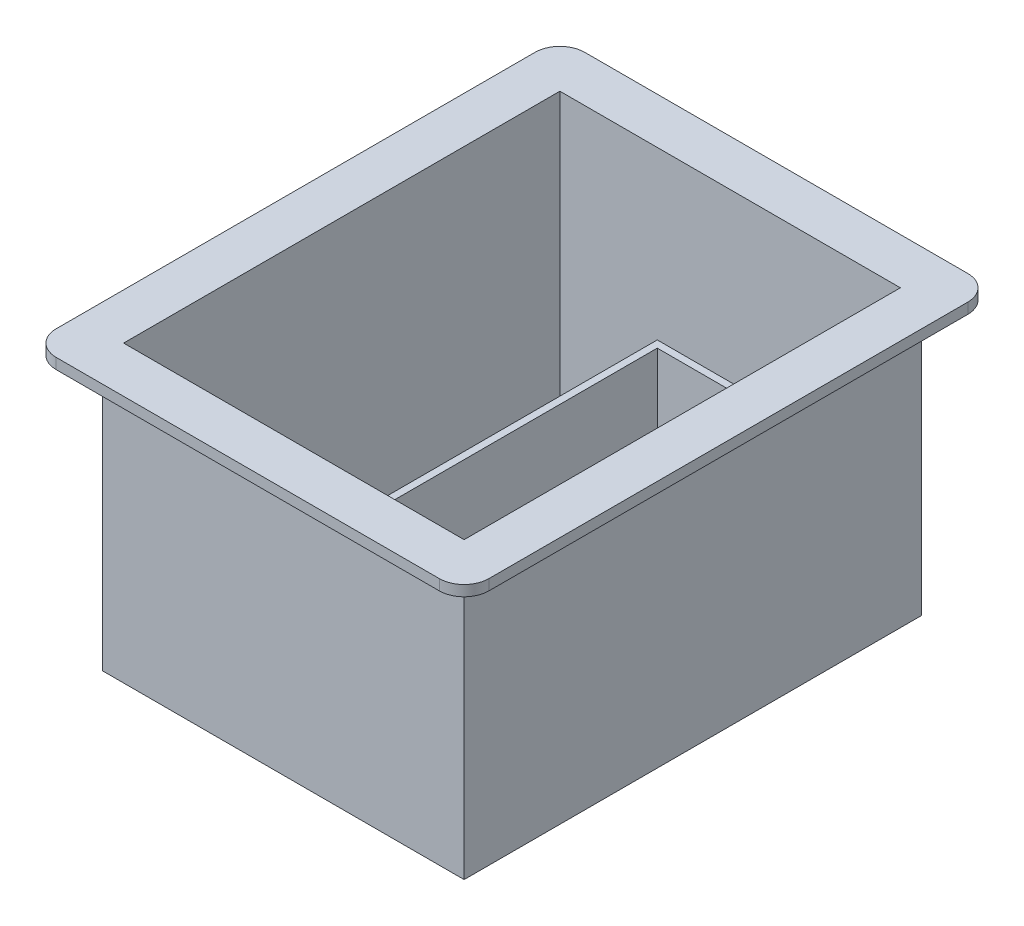
ISO-10303-21;
HEADER;
FILE_DESCRIPTION(('STEP AP214'),'2;1');
FILE_NAME('part.step','',(''),(''),'','','');
FILE_SCHEMA(('AUTOMOTIVE_DESIGN { 1 0 10303 214 1 1 1 1 }'));
ENDSEC;
DATA;
#1=APPLICATION_CONTEXT('core data for automotive mechanical design processes');
#2=APPLICATION_PROTOCOL_DEFINITION('international standard','automotive_design',2000,#1);
#3=PRODUCT_CONTEXT('',#1,'mechanical');
#4=PRODUCT('Part','Part','',(#3));
#5=PRODUCT_RELATED_PRODUCT_CATEGORY('part','',(#4));
#6=PRODUCT_DEFINITION_FORMATION('','',#4);
#7=PRODUCT_DEFINITION_CONTEXT('part definition',#1,'design');
#8=PRODUCT_DEFINITION('design','',#6,#7);
#9=PRODUCT_DEFINITION_SHAPE('','',#8);
#10=(LENGTH_UNIT() NAMED_UNIT(*) SI_UNIT(.MILLI.,.METRE.));
#11=(NAMED_UNIT(*) PLANE_ANGLE_UNIT() SI_UNIT($,.RADIAN.));
#12=(NAMED_UNIT(*) SI_UNIT($,.STERADIAN.) SOLID_ANGLE_UNIT());
#13=UNCERTAINTY_MEASURE_WITH_UNIT(LENGTH_MEASURE(1.E-05),#10,'distance_accuracy_value','');
#14=(GEOMETRIC_REPRESENTATION_CONTEXT(3) GLOBAL_UNCERTAINTY_ASSIGNED_CONTEXT((#13)) GLOBAL_UNIT_ASSIGNED_CONTEXT((#10,
#11,#12)) REPRESENTATION_CONTEXT('',''));
#15=CARTESIAN_POINT('',(0.,0.,0.));
#16=DIRECTION('',(0.,0.,1.));
#17=DIRECTION('',(1.,0.,0.));
#18=AXIS2_PLACEMENT_3D('',#15,#16,#17);
#19=CARTESIAN_POINT('',(0.,3.,0.));
#20=DIRECTION('',(0.,1.,0.));
#21=DIRECTION('',(0.,0.,1.));
#22=AXIS2_PLACEMENT_3D('',#19,#20,#21);
#23=PLANE('',#22);
#24=DIRECTION('',(1.,0.,0.));
#25=VECTOR('',#24,1.);
#26=CARTESIAN_POINT('',(30.4598158430387,3.,-38.5685944637824));
#27=LINE('',#26,#25);
#28=CARTESIAN_POINT('',(30.4598158430387,3.,-38.5685944637824));
#29=VERTEX_POINT('',#28);
#30=CARTESIAN_POINT('',(94.4598158430387,3.,-38.5685944637824));
#31=VERTEX_POINT('',#30);
#32=EDGE_CURVE('E339',#29,#31,#27,.T.);
#33=ORIENTED_EDGE('',*,*,#32,.F.);
#34=DIRECTION('',(0.,0.,1.));
#35=VECTOR('',#34,1.);
#36=CARTESIAN_POINT('',(30.4598158430387,3.,-127.568594463782));
#37=LINE('',#36,#35);
#38=CARTESIAN_POINT('',(30.4598158430387,3.,-126.));
#39=VERTEX_POINT('',#38);
#40=EDGE_CURVE('E288',#39,#29,#37,.T.);
#41=ORIENTED_EDGE('',*,*,#40,.F.);
#42=DIRECTION('',(-1.,0.,0.));
#43=VECTOR('',#42,1.);
#44=CARTESIAN_POINT('',(3.,3.,-126.));
#45=LINE('',#44,#43);
#46=CARTESIAN_POINT('',(3.,3.,-126.));
#47=VERTEX_POINT('',#46);
#48=EDGE_CURVE('E394',#39,#47,#45,.T.);
#49=ORIENTED_EDGE('',*,*,#48,.T.);
#50=DIRECTION('',(0.,0.,1.));
#51=VECTOR('',#50,1.);
#52=CARTESIAN_POINT('',(3.,3.,-126.));
#53=LINE('',#52,#51);
#54=CARTESIAN_POINT('',(3.00000000000003,3.,-37.));
#55=VERTEX_POINT('',#54);
#56=EDGE_CURVE('E382',#47,#55,#53,.T.);
#57=ORIENTED_EDGE('',*,*,#56,.T.);
#58=DIRECTION('',(-1.,0.,0.));
#59=VECTOR('',#58,1.);
#60=CARTESIAN_POINT('',(3.00000000000003,3.,-37.));
#61=LINE('',#60,#59);
#62=CARTESIAN_POINT('',(65.,3.,-37.));
#63=VERTEX_POINT('',#62);
#64=EDGE_CURVE('E357',#63,#55,#61,.T.);
#65=ORIENTED_EDGE('',*,*,#64,.F.);
#66=DIRECTION('',(0.,0.,-1.));
#67=VECTOR('',#66,1.);
#68=CARTESIAN_POINT('',(65.,3.,-2.99999999999999));
#69=LINE('',#68,#67);
#70=CARTESIAN_POINT('',(65.,3.,-2.99999999999999));
#71=VERTEX_POINT('',#70);
#72=EDGE_CURVE('E351',#71,#63,#69,.T.);
#73=ORIENTED_EDGE('',*,*,#72,.F.);
#74=DIRECTION('',(1.,0.,0.));
#75=VECTOR('',#74,1.);
#76=CARTESIAN_POINT('',(3.00000000000002,3.,-3.));
#77=LINE('',#76,#75);
#78=CARTESIAN_POINT('',(99.,3.,-3.));
#79=VERTEX_POINT('',#78);
#80=EDGE_CURVE('E386',#71,#79,#77,.T.);
#81=ORIENTED_EDGE('',*,*,#80,.T.);
#82=DIRECTION('',(0.,0.,-1.));
#83=VECTOR('',#82,1.);
#84=CARTESIAN_POINT('',(99.,3.,-126.));
#85=LINE('',#84,#83);
#86=CARTESIAN_POINT('',(99.,3.,-126.));
#87=VERTEX_POINT('',#86);
#88=EDGE_CURVE('E390',#79,#87,#85,.T.);
#89=ORIENTED_EDGE('',*,*,#88,.T.);
#90=CARTESIAN_POINT('',(94.4598158430387,3.,-126.));
#91=VERTEX_POINT('',#90);
#92=EDGE_CURVE('E395',#87,#91,#45,.T.);
#93=ORIENTED_EDGE('',*,*,#92,.T.);
#94=DIRECTION('',(0.,0.,-1.));
#95=VECTOR('',#94,1.);
#96=CARTESIAN_POINT('',(94.4598158430387,3.,-127.568594463782));
#97=LINE('',#96,#95);
#98=EDGE_CURVE('E330',#31,#91,#97,.T.);
#99=ORIENTED_EDGE('',*,*,#98,.F.);
#100=EDGE_LOOP('',(#33,#41,#49,#57,#65,#73,#81,#89,#93,#99));
#101=FACE_BOUND('',#100,.T.);
#102=ADVANCED_FACE('F39',(#101),#23,.T.);
#103=CARTESIAN_POINT('',(3.,3.,-126.));
#104=DIRECTION('',(0.,0.,-1.));
#105=DIRECTION('',(-1.,0.,0.));
#106=AXIS2_PLACEMENT_3D('',#103,#104,#105);
#107=PLANE('',#106);
#108=DIRECTION('',(0.,-1.,0.));
#109=VECTOR('',#108,1.);
#110=CARTESIAN_POINT('',(30.4598158430387,3.,-126.));
#111=LINE('',#110,#109);
#112=CARTESIAN_POINT('',(30.4598158430387,33.,-126.));
#113=VERTEX_POINT('',#112);
#114=EDGE_CURVE('E507',#113,#39,#111,.T.);
#115=ORIENTED_EDGE('',*,*,#114,.F.);
#116=DIRECTION('',(1.,0.,0.));
#117=VECTOR('',#116,1.);
#118=CARTESIAN_POINT('',(3.,33.,-126.));
#119=LINE('',#118,#117);
#120=CARTESIAN_POINT('',(94.4598158430387,33.,-126.));
#121=VERTEX_POINT('',#120);
#122=EDGE_CURVE('E499',#113,#121,#119,.T.);
#123=ORIENTED_EDGE('',*,*,#122,.T.);
#124=DIRECTION('',(0.,1.,0.));
#125=VECTOR('',#124,1.);
#126=CARTESIAN_POINT('',(94.4598158430387,3.,-126.));
#127=LINE('',#126,#125);
#128=EDGE_CURVE('E503',#91,#121,#127,.T.);
#129=ORIENTED_EDGE('',*,*,#128,.F.);
#130=ORIENTED_EDGE('',*,*,#92,.F.);
#131=DIRECTION('',(0.,1.,0.));
#132=VECTOR('',#131,1.);
#133=CARTESIAN_POINT('',(99.,3.,-126.));
#134=LINE('',#133,#132);
#135=CARTESIAN_POINT('',(99.,80.,-126.));
#136=VERTEX_POINT('',#135);
#137=EDGE_CURVE('E418',#87,#136,#134,.T.);
#138=ORIENTED_EDGE('',*,*,#137,.T.);
#139=DIRECTION('',(-1.,0.,0.));
#140=VECTOR('',#139,1.);
#141=CARTESIAN_POINT('',(3.,80.,-126.));
#142=LINE('',#141,#140);
#143=CARTESIAN_POINT('',(3.,80.,-126.));
#144=VERTEX_POINT('',#143);
#145=EDGE_CURVE('E387',#136,#144,#142,.T.);
#146=ORIENTED_EDGE('',*,*,#145,.T.);
#147=DIRECTION('',(0.,1.,0.));
#148=VECTOR('',#147,1.);
#149=CARTESIAN_POINT('',(3.,3.,-126.));
#150=LINE('',#149,#148);
#151=EDGE_CURVE('E414',#47,#144,#150,.T.);
#152=ORIENTED_EDGE('',*,*,#151,.F.);
#153=ORIENTED_EDGE('',*,*,#48,.F.);
#154=EDGE_LOOP('',(#115,#123,#129,#130,#138,#146,#152,#153));
#155=FACE_BOUND('',#154,.T.);
#156=ADVANCED_FACE('F594',(#155),#107,.F.);
#157=CARTESIAN_POINT('',(3.,3.,-126.));
#158=DIRECTION('',(-1.,0.,0.));
#159=DIRECTION('',(0.,0.,1.));
#160=AXIS2_PLACEMENT_3D('',#157,#158,#159);
#161=PLANE('',#160);
#162=DIRECTION('',(0.,-1.,0.));
#163=VECTOR('',#162,1.);
#164=CARTESIAN_POINT('',(3.00000000000003,33.,-37.));
#165=LINE('',#164,#163);
#166=CARTESIAN_POINT('',(3.00000000000003,33.,-37.));
#167=VERTEX_POINT('',#166);
#168=EDGE_CURVE('E366',#167,#55,#165,.T.);
#169=ORIENTED_EDGE('',*,*,#168,.T.);
#170=ORIENTED_EDGE('',*,*,#56,.F.);
#171=ORIENTED_EDGE('',*,*,#151,.T.);
#172=DIRECTION('',(0.,0.,1.));
#173=VECTOR('',#172,1.);
#174=CARTESIAN_POINT('',(3.,80.,-126.));
#175=LINE('',#174,#173);
#176=CARTESIAN_POINT('',(3.00000000000002,80.,-3.));
#177=VERTEX_POINT('',#176);
#178=EDGE_CURVE('E381',#144,#177,#175,.T.);
#179=ORIENTED_EDGE('',*,*,#178,.T.);
#180=DIRECTION('',(0.,1.,0.));
#181=VECTOR('',#180,1.);
#182=CARTESIAN_POINT('',(3.00000000000002,3.,-3.));
#183=LINE('',#182,#181);
#184=CARTESIAN_POINT('',(3.00000000000002,3.,-3.));
#185=VERTEX_POINT('',#184);
#186=EDGE_CURVE('E399',#185,#177,#183,.T.);
#187=ORIENTED_EDGE('',*,*,#186,.F.);
#188=DIRECTION('',(0.,0.,1.));
#189=VECTOR('',#188,1.);
#190=CARTESIAN_POINT('',(3.00000000000002,3.,-3.));
#191=LINE('',#190,#189);
#192=CARTESIAN_POINT('',(3.00000000000002,3.,-35.));
#193=VERTEX_POINT('',#192);
#194=EDGE_CURVE('E294',#193,#185,#191,.T.);
#195=ORIENTED_EDGE('',*,*,#194,.F.);
#196=DIRECTION('',(0.,1.,0.));
#197=VECTOR('',#196,1.);
#198=CARTESIAN_POINT('',(3.00000000000002,3.,-35.));
#199=LINE('',#198,#197);
#200=CARTESIAN_POINT('',(3.00000000000002,33.,-35.));
#201=VERTEX_POINT('',#200);
#202=EDGE_CURVE('E279',#193,#201,#199,.T.);
#203=ORIENTED_EDGE('',*,*,#202,.T.);
#204=DIRECTION('',(0.,0.,1.));
#205=VECTOR('',#204,1.);
#206=CARTESIAN_POINT('',(3.00000000000003,33.,-2.99999999999999));
#207=LINE('',#206,#205);
#208=EDGE_CURVE('E352',#167,#201,#207,.T.);
#209=ORIENTED_EDGE('',*,*,#208,.F.);
#210=EDGE_LOOP('',(#169,#170,#171,#179,#187,#195,#203,#209));
#211=FACE_BOUND('',#210,.T.);
#212=ADVANCED_FACE('F600',(#211),#161,.F.);
#213=CARTESIAN_POINT('',(3.00000000000002,3.,-3.));
#214=DIRECTION('',(0.,0.,1.));
#215=DIRECTION('',(1.,0.,0.));
#216=AXIS2_PLACEMENT_3D('',#213,#214,#215);
#217=PLANE('',#216);
#218=DIRECTION('',(0.,-1.,0.));
#219=VECTOR('',#218,1.);
#220=CARTESIAN_POINT('',(65.,33.,-2.99999999999999));
#221=LINE('',#220,#219);
#222=CARTESIAN_POINT('',(65.,33.,-2.99999999999999));
#223=VERTEX_POINT('',#222);
#224=EDGE_CURVE('E378',#223,#71,#221,.T.);
#225=ORIENTED_EDGE('',*,*,#224,.F.);
#226=DIRECTION('',(1.,0.,0.));
#227=VECTOR('',#226,1.);
#228=CARTESIAN_POINT('',(3.00000000000003,33.,-2.99999999999999));
#229=LINE('',#228,#227);
#230=CARTESIAN_POINT('',(63.,33.,-3.));
#231=VERTEX_POINT('',#230);
#232=EDGE_CURVE('E356',#231,#223,#229,.T.);
#233=ORIENTED_EDGE('',*,*,#232,.F.);
#234=DIRECTION('',(0.,1.,0.));
#235=VECTOR('',#234,1.);
#236=CARTESIAN_POINT('',(63.,3.,-3.));
#237=LINE('',#236,#235);
#238=CARTESIAN_POINT('',(63.,3.,-3.));
#239=VERTEX_POINT('',#238);
#240=EDGE_CURVE('E311',#239,#231,#237,.T.);
#241=ORIENTED_EDGE('',*,*,#240,.F.);
#242=DIRECTION('',(1.,0.,0.));
#243=VECTOR('',#242,1.);
#244=CARTESIAN_POINT('',(3.00000000000002,3.,-3.));
#245=LINE('',#244,#243);
#246=EDGE_CURVE('E298',#185,#239,#245,.T.);
#247=ORIENTED_EDGE('',*,*,#246,.F.);
#248=ORIENTED_EDGE('',*,*,#186,.T.);
#249=DIRECTION('',(1.,0.,0.));
#250=VECTOR('',#249,1.);
#251=CARTESIAN_POINT('',(3.00000000000002,80.,-3.));
#252=LINE('',#251,#250);
#253=CARTESIAN_POINT('',(99.,80.,-3.));
#254=VERTEX_POINT('',#253);
#255=EDGE_CURVE('E403',#177,#254,#252,.T.);
#256=ORIENTED_EDGE('',*,*,#255,.T.);
#257=DIRECTION('',(0.,1.,0.));
#258=VECTOR('',#257,1.);
#259=CARTESIAN_POINT('',(99.,3.,-3.));
#260=LINE('',#259,#258);
#261=EDGE_CURVE('E421',#79,#254,#260,.T.);
#262=ORIENTED_EDGE('',*,*,#261,.F.);
#263=ORIENTED_EDGE('',*,*,#80,.F.);
#264=EDGE_LOOP('',(#225,#233,#241,#247,#248,#256,#262,#263));
#265=FACE_BOUND('',#264,.T.);
#266=ADVANCED_FACE('F612',(#265),#217,.F.);
#267=CARTESIAN_POINT('',(0.,77.,0.));
#268=DIRECTION('',(1.,0.,0.));
#269=DIRECTION('',(0.,0.,-1.));
#270=AXIS2_PLACEMENT_3D('',#267,#268,#269);
#271=PLANE('',#270);
#272=DIRECTION('',(0.,0.,1.));
#273=VECTOR('',#272,1.);
#274=CARTESIAN_POINT('',(0.,0.,0.));
#275=LINE('',#274,#273);
#276=CARTESIAN_POINT('',(0.,0.,-129.));
#277=VERTEX_POINT('',#276);
#278=CARTESIAN_POINT('',(0.,0.,0.));
#279=VERTEX_POINT('',#278);
#280=EDGE_CURVE('E441',#277,#279,#275,.T.);
#281=ORIENTED_EDGE('',*,*,#280,.T.);
#282=DIRECTION('',(0.,-1.,0.));
#283=VECTOR('',#282,1.);
#284=CARTESIAN_POINT('',(0.,77.,0.));
#285=LINE('',#284,#283);
#286=CARTESIAN_POINT('',(0.,77.,0.));
#287=VERTEX_POINT('',#286);
#288=EDGE_CURVE('E495',#287,#279,#285,.T.);
#289=ORIENTED_EDGE('',*,*,#288,.F.);
#290=DIRECTION('',(0.,0.,1.));
#291=VECTOR('',#290,1.);
#292=CARTESIAN_POINT('',(0.,77.,0.));
#293=LINE('',#292,#291);
#294=CARTESIAN_POINT('',(0.,77.,-129.));
#295=VERTEX_POINT('',#294);
#296=EDGE_CURVE('E455',#295,#287,#293,.T.);
#297=ORIENTED_EDGE('',*,*,#296,.F.);
#298=DIRECTION('',(0.,-1.,0.));
#299=VECTOR('',#298,1.);
#300=CARTESIAN_POINT('',(0.,77.,-129.));
#301=LINE('',#300,#299);
#302=EDGE_CURVE('E472',#295,#277,#301,.T.);
#303=ORIENTED_EDGE('',*,*,#302,.T.);
#304=EDGE_LOOP('',(#281,#289,#297,#303));
#305=FACE_BOUND('',#304,.T.);
#306=ADVANCED_FACE('F615',(#305),#271,.F.);
#307=CARTESIAN_POINT('',(0.,77.,0.));
#308=DIRECTION('',(0.,0.,-1.));
#309=DIRECTION('',(-1.,0.,0.));
#310=AXIS2_PLACEMENT_3D('',#307,#308,#309);
#311=PLANE('',#310);
#312=DIRECTION('',(1.,0.,0.));
#313=VECTOR('',#312,1.);
#314=CARTESIAN_POINT('',(0.,0.,0.));
#315=LINE('',#314,#313);
#316=CARTESIAN_POINT('',(102.,0.,0.));
#317=VERTEX_POINT('',#316);
#318=EDGE_CURVE('E476',#279,#317,#315,.T.);
#319=ORIENTED_EDGE('',*,*,#318,.T.);
#320=DIRECTION('',(0.,-1.,0.));
#321=VECTOR('',#320,1.);
#322=CARTESIAN_POINT('',(102.,77.,0.));
#323=LINE('',#322,#321);
#324=CARTESIAN_POINT('',(102.,77.,0.));
#325=VERTEX_POINT('',#324);
#326=EDGE_CURVE('E491',#325,#317,#323,.T.);
#327=ORIENTED_EDGE('',*,*,#326,.F.);
#328=DIRECTION('',(1.,0.,0.));
#329=VECTOR('',#328,1.);
#330=CARTESIAN_POINT('',(0.,77.,0.));
#331=LINE('',#330,#329);
#332=EDGE_CURVE('E459',#287,#325,#331,.T.);
#333=ORIENTED_EDGE('',*,*,#332,.F.);
#334=ORIENTED_EDGE('',*,*,#288,.T.);
#335=EDGE_LOOP('',(#319,#327,#333,#334));
#336=FACE_BOUND('',#335,.T.);
#337=ADVANCED_FACE('F644',(#336),#311,.F.);
#338=CARTESIAN_POINT('',(102.,77.,0.));
#339=DIRECTION('',(-1.,0.,0.));
#340=DIRECTION('',(0.,0.,1.));
#341=AXIS2_PLACEMENT_3D('',#338,#339,#340);
#342=PLANE('',#341);
#343=DIRECTION('',(0.,0.,-1.));
#344=VECTOR('',#343,1.);
#345=CARTESIAN_POINT('',(102.,0.,0.));
#346=LINE('',#345,#344);
#347=CARTESIAN_POINT('',(102.,0.,-129.));
#348=VERTEX_POINT('',#347);
#349=EDGE_CURVE('E479',#317,#348,#346,.T.);
#350=ORIENTED_EDGE('',*,*,#349,.T.);
#351=DIRECTION('',(0.,-1.,0.));
#352=VECTOR('',#351,1.);
#353=CARTESIAN_POINT('',(102.,77.,-129.));
#354=LINE('',#353,#352);
#355=CARTESIAN_POINT('',(102.,77.,-129.));
#356=VERTEX_POINT('',#355);
#357=EDGE_CURVE('E487',#356,#348,#354,.T.);
#358=ORIENTED_EDGE('',*,*,#357,.F.);
#359=DIRECTION('',(0.,0.,-1.));
#360=VECTOR('',#359,1.);
#361=CARTESIAN_POINT('',(102.,77.,0.));
#362=LINE('',#361,#360);
#363=EDGE_CURVE('E464',#325,#356,#362,.T.);
#364=ORIENTED_EDGE('',*,*,#363,.F.);
#365=ORIENTED_EDGE('',*,*,#326,.T.);
#366=EDGE_LOOP('',(#350,#358,#364,#365));
#367=FACE_BOUND('',#366,.T.);
#368=ADVANCED_FACE('F640',(#367),#342,.F.);
#369=CARTESIAN_POINT('',(0.,77.,-129.));
#370=DIRECTION('',(0.,0.,1.));
#371=DIRECTION('',(1.,0.,0.));
#372=AXIS2_PLACEMENT_3D('',#369,#370,#371);
#373=PLANE('',#372);
#374=DIRECTION('',(-1.,0.,0.));
#375=VECTOR('',#374,1.);
#376=CARTESIAN_POINT('',(0.,0.,-129.));
#377=LINE('',#376,#375);
#378=EDGE_CURVE('E460',#348,#277,#377,.T.);
#379=ORIENTED_EDGE('',*,*,#378,.T.);
#380=ORIENTED_EDGE('',*,*,#302,.F.);
#381=DIRECTION('',(-1.,0.,0.));
#382=VECTOR('',#381,1.);
#383=CARTESIAN_POINT('',(0.,77.,-129.));
#384=LINE('',#383,#382);
#385=EDGE_CURVE('E468',#356,#295,#384,.T.);
#386=ORIENTED_EDGE('',*,*,#385,.F.);
#387=ORIENTED_EDGE('',*,*,#357,.T.);
#388=EDGE_LOOP('',(#379,#380,#386,#387));
#389=FACE_BOUND('',#388,.T.);
#390=ADVANCED_FACE('F636',(#389),#373,.F.);
#391=CARTESIAN_POINT('',(0.,0.,0.));
#392=DIRECTION('',(0.,-1.,0.));
#393=DIRECTION('',(0.,0.,-1.));
#394=AXIS2_PLACEMENT_3D('',#391,#392,#393);
#395=PLANE('',#394);
#396=ORIENTED_EDGE('',*,*,#280,.F.);
#397=ORIENTED_EDGE('',*,*,#378,.F.);
#398=ORIENTED_EDGE('',*,*,#349,.F.);
#399=ORIENTED_EDGE('',*,*,#318,.F.);
#400=EDGE_LOOP('',(#396,#397,#398,#399));
#401=FACE_BOUND('',#400,.T.);
#402=ADVANCED_FACE('F625',(#401),#395,.T.);
#403=CARTESIAN_POINT('',(0.,77.,0.));
#404=DIRECTION('',(0.,1.,0.));
#405=DIRECTION('',(0.,0.,1.));
#406=AXIS2_PLACEMENT_3D('',#403,#404,#405);
#407=PLANE('',#406);
#408=DIRECTION('',(0.,0.,1.));
#409=VECTOR('',#408,1.);
#410=CARTESIAN_POINT('',(-10.,77.,-139.));
#411=LINE('',#410,#409);
#412=CARTESIAN_POINT('',(-10.,77.,-132.));
#413=VERTEX_POINT('',#412);
#414=CARTESIAN_POINT('',(-9.99999999999998,77.,3.));
#415=VERTEX_POINT('',#414);
#416=EDGE_CURVE('E417',#413,#415,#411,.T.);
#417=ORIENTED_EDGE('',*,*,#416,.F.);
#418=CARTESIAN_POINT('',(-3.,77.,-132.));
#419=DIRECTION('',(0.,1.,0.));
#420=DIRECTION('',(0.,0.,1.));
#421=AXIS2_PLACEMENT_3D('',#418,#419,#420);
#422=CIRCLE('',#421,7.);
#423=CARTESIAN_POINT('',(-3.,77.,-139.));
#424=VERTEX_POINT('',#423);
#425=EDGE_CURVE('E526',#413,#424,#422,.F.);
#426=ORIENTED_EDGE('',*,*,#425,.T.);
#427=DIRECTION('',(-1.,0.,0.));
#428=VECTOR('',#427,1.);
#429=CARTESIAN_POINT('',(-10.,77.,-139.));
#430=LINE('',#429,#428);
#431=CARTESIAN_POINT('',(105.,77.,-139.));
#432=VERTEX_POINT('',#431);
#433=EDGE_CURVE('E431',#432,#424,#430,.T.);
#434=ORIENTED_EDGE('',*,*,#433,.F.);
#435=CARTESIAN_POINT('',(105.,77.,-132.));
#436=DIRECTION('',(0.,1.,0.));
#437=DIRECTION('',(0.,0.,1.));
#438=AXIS2_PLACEMENT_3D('',#435,#436,#437);
#439=CIRCLE('',#438,7.);
#440=CARTESIAN_POINT('',(112.,77.,-132.));
#441=VERTEX_POINT('',#440);
#442=EDGE_CURVE('E523',#432,#441,#439,.F.);
#443=ORIENTED_EDGE('',*,*,#442,.T.);
#444=DIRECTION('',(0.,0.,-1.));
#445=VECTOR('',#444,1.);
#446=CARTESIAN_POINT('',(112.,77.,-139.));
#447=LINE('',#446,#445);
#448=CARTESIAN_POINT('',(112.,77.,3.));
#449=VERTEX_POINT('',#448);
#450=EDGE_CURVE('E449',#449,#441,#447,.T.);
#451=ORIENTED_EDGE('',*,*,#450,.F.);
#452=CARTESIAN_POINT('',(105.,77.,3.));
#453=DIRECTION('',(0.,1.,0.));
#454=DIRECTION('',(0.,0.,1.));
#455=AXIS2_PLACEMENT_3D('',#452,#453,#454);
#456=CIRCLE('',#455,7.);
#457=CARTESIAN_POINT('',(105.,77.,10.));
#458=VERTEX_POINT('',#457);
#459=EDGE_CURVE('E520',#449,#458,#456,.F.);
#460=ORIENTED_EDGE('',*,*,#459,.T.);
#461=DIRECTION('',(1.,0.,0.));
#462=VECTOR('',#461,1.);
#463=CARTESIAN_POINT('',(-9.99999999999998,77.,10.));
#464=LINE('',#463,#462);
#465=CARTESIAN_POINT('',(-2.99999999999998,77.,10.));
#466=VERTEX_POINT('',#465);
#467=EDGE_CURVE('E445',#466,#458,#464,.T.);
#468=ORIENTED_EDGE('',*,*,#467,.F.);
#469=CARTESIAN_POINT('',(-2.99999999999998,77.,3.));
#470=DIRECTION('',(0.,1.,0.));
#471=DIRECTION('',(0.,0.,1.));
#472=AXIS2_PLACEMENT_3D('',#469,#470,#471);
#473=CIRCLE('',#472,7.);
#474=EDGE_CURVE('E517',#466,#415,#473,.F.);
#475=ORIENTED_EDGE('',*,*,#474,.T.);
#476=EDGE_LOOP('',(#417,#426,#434,#443,#451,#460,#468,#475));
#477=FACE_BOUND('',#476,.T.);
#478=ORIENTED_EDGE('',*,*,#385,.T.);
#479=ORIENTED_EDGE('',*,*,#296,.T.);
#480=ORIENTED_EDGE('',*,*,#332,.T.);
#481=ORIENTED_EDGE('',*,*,#363,.T.);
#482=EDGE_LOOP('',(#478,#479,#480,#481));
#483=FACE_BOUND('',#482,.T.);
#484=ADVANCED_FACE('F564',(#477,#483),#407,.F.);
#485=CARTESIAN_POINT('',(-10.,80.,-139.));
#486=DIRECTION('',(1.,0.,0.));
#487=DIRECTION('',(0.,0.,-1.));
#488=AXIS2_PLACEMENT_3D('',#485,#486,#487);
#489=PLANE('',#488);
#490=DIRECTION('',(0.,0.,1.));
#491=VECTOR('',#490,1.);
#492=CARTESIAN_POINT('',(-10.,80.,-139.));
#493=LINE('',#492,#491);
#494=CARTESIAN_POINT('',(-10.,80.,-132.));
#495=VERTEX_POINT('',#494);
#496=CARTESIAN_POINT('',(-9.99999999999998,80.,3.));
#497=VERTEX_POINT('',#496);
#498=EDGE_CURVE('E426',#495,#497,#493,.T.);
#499=ORIENTED_EDGE('',*,*,#498,.F.);
#500=DIRECTION('',(0.,-1.,0.));
#501=VECTOR('',#500,1.);
#502=CARTESIAN_POINT('',(-10.,80.,-132.));
#503=LINE('',#502,#501);
#504=EDGE_CURVE('E513',#495,#413,#503,.T.);
#505=ORIENTED_EDGE('',*,*,#504,.T.);
#506=ORIENTED_EDGE('',*,*,#416,.T.);
#507=DIRECTION('',(0.,-1.,0.));
#508=VECTOR('',#507,1.);
#509=CARTESIAN_POINT('',(-9.99999999999998,80.,3.));
#510=LINE('',#509,#508);
#511=EDGE_CURVE('E510',#415,#497,#510,.F.);
#512=ORIENTED_EDGE('',*,*,#511,.T.);
#513=EDGE_LOOP('',(#499,#505,#506,#512));
#514=FACE_BOUND('',#513,.T.);
#515=ADVANCED_FACE('F587',(#514),#489,.F.);
#516=CARTESIAN_POINT('',(-9.99999999999998,80.,10.));
#517=DIRECTION('',(0.,0.,-1.));
#518=DIRECTION('',(-1.,0.,0.));
#519=AXIS2_PLACEMENT_3D('',#516,#517,#518);
#520=PLANE('',#519);
#521=ORIENTED_EDGE('',*,*,#467,.T.);
#522=DIRECTION('',(0.,-1.,0.));
#523=VECTOR('',#522,1.);
#524=CARTESIAN_POINT('',(105.,80.,10.));
#525=LINE('',#524,#523);
#526=CARTESIAN_POINT('',(105.,80.,10.));
#527=VERTEX_POINT('',#526);
#528=EDGE_CURVE('E11',#458,#527,#525,.F.);
#529=ORIENTED_EDGE('',*,*,#528,.T.);
#530=DIRECTION('',(1.,0.,0.));
#531=VECTOR('',#530,1.);
#532=CARTESIAN_POINT('',(-9.99999999999998,80.,10.));
#533=LINE('',#532,#531);
#534=CARTESIAN_POINT('',(-2.99999999999998,80.,10.));
#535=VERTEX_POINT('',#534);
#536=EDGE_CURVE('E430',#535,#527,#533,.T.);
#537=ORIENTED_EDGE('',*,*,#536,.F.);
#538=DIRECTION('',(0.,-1.,0.));
#539=VECTOR('',#538,1.);
#540=CARTESIAN_POINT('',(-2.99999999999998,80.,10.));
#541=LINE('',#540,#539);
#542=EDGE_CURVE('E48',#535,#466,#541,.T.);
#543=ORIENTED_EDGE('',*,*,#542,.T.);
#544=EDGE_LOOP('',(#521,#529,#537,#543));
#545=FACE_BOUND('',#544,.T.);
#546=ADVANCED_FACE('F558',(#545),#520,.F.);
#547=CARTESIAN_POINT('',(112.,80.,-139.));
#548=DIRECTION('',(-1.,0.,0.));
#549=DIRECTION('',(0.,0.,1.));
#550=AXIS2_PLACEMENT_3D('',#547,#548,#549);
#551=PLANE('',#550);
#552=ORIENTED_EDGE('',*,*,#450,.T.);
#553=DIRECTION('',(0.,-1.,0.));
#554=VECTOR('',#553,1.);
#555=CARTESIAN_POINT('',(112.,80.,-132.));
#556=LINE('',#555,#554);
#557=CARTESIAN_POINT('',(112.,80.,-132.));
#558=VERTEX_POINT('',#557);
#559=EDGE_CURVE('E55',#441,#558,#556,.F.);
#560=ORIENTED_EDGE('',*,*,#559,.T.);
#561=DIRECTION('',(0.,0.,-1.));
#562=VECTOR('',#561,1.);
#563=CARTESIAN_POINT('',(112.,80.,-139.));
#564=LINE('',#563,#562);
#565=CARTESIAN_POINT('',(112.,80.,3.));
#566=VERTEX_POINT('',#565);
#567=EDGE_CURVE('E434',#566,#558,#564,.T.);
#568=ORIENTED_EDGE('',*,*,#567,.F.);
#569=DIRECTION('',(0.,-1.,0.));
#570=VECTOR('',#569,1.);
#571=CARTESIAN_POINT('',(112.,80.,3.));
#572=LINE('',#571,#570);
#573=EDGE_CURVE('E547',#566,#449,#572,.T.);
#574=ORIENTED_EDGE('',*,*,#573,.T.);
#575=EDGE_LOOP('',(#552,#560,#568,#574));
#576=FACE_BOUND('',#575,.T.);
#577=ADVANCED_FACE('F570',(#576),#551,.F.);
#578=CARTESIAN_POINT('',(-10.,80.,-139.));
#579=DIRECTION('',(0.,0.,1.));
#580=DIRECTION('',(1.,0.,0.));
#581=AXIS2_PLACEMENT_3D('',#578,#579,#580);
#582=PLANE('',#581);
#583=ORIENTED_EDGE('',*,*,#433,.T.);
#584=DIRECTION('',(0.,-1.,0.));
#585=VECTOR('',#584,1.);
#586=CARTESIAN_POINT('',(-3.,80.,-139.));
#587=LINE('',#586,#585);
#588=CARTESIAN_POINT('',(-3.,80.,-139.));
#589=VERTEX_POINT('',#588);
#590=EDGE_CURVE('E533',#424,#589,#587,.F.);
#591=ORIENTED_EDGE('',*,*,#590,.T.);
#592=DIRECTION('',(-1.,0.,0.));
#593=VECTOR('',#592,1.);
#594=CARTESIAN_POINT('',(-10.,80.,-139.));
#595=LINE('',#594,#593);
#596=CARTESIAN_POINT('',(105.,80.,-139.));
#597=VERTEX_POINT('',#596);
#598=EDGE_CURVE('E437',#597,#589,#595,.T.);
#599=ORIENTED_EDGE('',*,*,#598,.F.);
#600=DIRECTION('',(0.,-1.,0.));
#601=VECTOR('',#600,1.);
#602=CARTESIAN_POINT('',(105.,80.,-139.));
#603=LINE('',#602,#601);
#604=EDGE_CURVE('E529',#597,#432,#603,.T.);
#605=ORIENTED_EDGE('',*,*,#604,.T.);
#606=EDGE_LOOP('',(#583,#591,#599,#605));
#607=FACE_BOUND('',#606,.T.);
#608=ADVANCED_FACE('F579',(#607),#582,.F.);
#609=CARTESIAN_POINT('',(0.,80.,0.));
#610=DIRECTION('',(0.,1.,0.));
#611=DIRECTION('',(0.,0.,1.));
#612=AXIS2_PLACEMENT_3D('',#609,#610,#611);
#613=PLANE('',#612);
#614=ORIENTED_EDGE('',*,*,#178,.F.);
#615=ORIENTED_EDGE('',*,*,#145,.F.);
#616=DIRECTION('',(0.,0.,-1.));
#617=VECTOR('',#616,1.);
#618=CARTESIAN_POINT('',(99.,80.,-126.));
#619=LINE('',#618,#617);
#620=EDGE_CURVE('E407',#254,#136,#619,.T.);
#621=ORIENTED_EDGE('',*,*,#620,.F.);
#622=ORIENTED_EDGE('',*,*,#255,.F.);
#623=EDGE_LOOP('',(#614,#615,#621,#622));
#624=FACE_BOUND('',#623,.T.);
#625=ORIENTED_EDGE('',*,*,#598,.T.);
#626=CARTESIAN_POINT('',(-3.,80.,-132.));
#627=DIRECTION('',(0.,1.,0.));
#628=DIRECTION('',(0.,0.,1.));
#629=AXIS2_PLACEMENT_3D('',#626,#627,#628);
#630=CIRCLE('',#629,7.);
#631=EDGE_CURVE('E544',#589,#495,#630,.T.);
#632=ORIENTED_EDGE('',*,*,#631,.T.);
#633=ORIENTED_EDGE('',*,*,#498,.T.);
#634=CARTESIAN_POINT('',(-2.99999999999998,80.,3.));
#635=DIRECTION('',(0.,1.,0.));
#636=DIRECTION('',(0.,0.,1.));
#637=AXIS2_PLACEMENT_3D('',#634,#635,#636);
#638=CIRCLE('',#637,7.);
#639=EDGE_CURVE('E536',#497,#535,#638,.T.);
#640=ORIENTED_EDGE('',*,*,#639,.T.);
#641=ORIENTED_EDGE('',*,*,#536,.T.);
#642=CARTESIAN_POINT('',(105.,80.,3.));
#643=DIRECTION('',(0.,1.,0.));
#644=DIRECTION('',(0.,0.,1.));
#645=AXIS2_PLACEMENT_3D('',#642,#643,#644);
#646=CIRCLE('',#645,7.);
#647=EDGE_CURVE('E62',#527,#566,#646,.T.);
#648=ORIENTED_EDGE('',*,*,#647,.T.);
#649=ORIENTED_EDGE('',*,*,#567,.T.);
#650=CARTESIAN_POINT('',(105.,80.,-132.));
#651=DIRECTION('',(0.,1.,0.));
#652=DIRECTION('',(0.,0.,1.));
#653=AXIS2_PLACEMENT_3D('',#650,#651,#652);
#654=CIRCLE('',#653,7.);
#655=EDGE_CURVE('E541',#558,#597,#654,.T.);
#656=ORIENTED_EDGE('',*,*,#655,.T.);
#657=EDGE_LOOP('',(#625,#632,#633,#640,#641,#648,#649,#656));
#658=FACE_BOUND('',#657,.T.);
#659=ADVANCED_FACE('F572',(#624,#658),#613,.T.);
#660=CARTESIAN_POINT('',(99.,3.,-126.));
#661=DIRECTION('',(1.,0.,0.));
#662=DIRECTION('',(0.,0.,-1.));
#663=AXIS2_PLACEMENT_3D('',#660,#661,#662);
#664=PLANE('',#663);
#665=ORIENTED_EDGE('',*,*,#620,.T.);
#666=ORIENTED_EDGE('',*,*,#137,.F.);
#667=ORIENTED_EDGE('',*,*,#88,.F.);
#668=ORIENTED_EDGE('',*,*,#261,.T.);
#669=EDGE_LOOP('',(#665,#666,#667,#668));
#670=FACE_BOUND('',#669,.T.);
#671=ADVANCED_FACE('F608',(#670),#664,.F.);
#672=CARTESIAN_POINT('',(65.,33.,-2.99999999999999));
#673=DIRECTION('',(-1.,0.,0.));
#674=DIRECTION('',(0.,0.,1.));
#675=AXIS2_PLACEMENT_3D('',#672,#673,#674);
#676=PLANE('',#675);
#677=ORIENTED_EDGE('',*,*,#72,.T.);
#678=DIRECTION('',(0.,-1.,0.));
#679=VECTOR('',#678,1.);
#680=CARTESIAN_POINT('',(65.,33.,-37.));
#681=LINE('',#680,#679);
#682=CARTESIAN_POINT('',(65.,33.,-37.));
#683=VERTEX_POINT('',#682);
#684=EDGE_CURVE('E375',#683,#63,#681,.T.);
#685=ORIENTED_EDGE('',*,*,#684,.F.);
#686=DIRECTION('',(0.,0.,-1.));
#687=VECTOR('',#686,1.);
#688=CARTESIAN_POINT('',(65.,33.,-2.99999999999999));
#689=LINE('',#688,#687);
#690=EDGE_CURVE('E360',#223,#683,#689,.T.);
#691=ORIENTED_EDGE('',*,*,#690,.F.);
#692=ORIENTED_EDGE('',*,*,#224,.T.);
#693=EDGE_LOOP('',(#677,#685,#691,#692));
#694=FACE_BOUND('',#693,.T.);
#695=ADVANCED_FACE('F605',(#694),#676,.F.);
#696=CARTESIAN_POINT('',(3.00000000000003,33.,-37.));
#697=DIRECTION('',(0.,0.,1.));
#698=DIRECTION('',(1.,0.,0.));
#699=AXIS2_PLACEMENT_3D('',#696,#697,#698);
#700=PLANE('',#699);
#701=ORIENTED_EDGE('',*,*,#64,.T.);
#702=ORIENTED_EDGE('',*,*,#168,.F.);
#703=DIRECTION('',(-1.,0.,0.));
#704=VECTOR('',#703,1.);
#705=CARTESIAN_POINT('',(3.00000000000003,33.,-37.));
#706=LINE('',#705,#704);
#707=EDGE_CURVE('E363',#683,#167,#706,.T.);
#708=ORIENTED_EDGE('',*,*,#707,.F.);
#709=ORIENTED_EDGE('',*,*,#684,.T.);
#710=EDGE_LOOP('',(#701,#702,#708,#709));
#711=FACE_BOUND('',#710,.T.);
#712=ADVANCED_FACE('F807',(#711),#700,.F.);
#713=CARTESIAN_POINT('',(0.,33.,0.));
#714=DIRECTION('',(0.,-1.,0.));
#715=DIRECTION('',(0.,0.,-1.));
#716=AXIS2_PLACEMENT_3D('',#713,#714,#715);
#717=PLANE('',#716);
#718=ORIENTED_EDGE('',*,*,#208,.T.);
#719=DIRECTION('',(-1.,0.,0.));
#720=VECTOR('',#719,1.);
#721=CARTESIAN_POINT('',(3.00000000000002,33.,-35.));
#722=LINE('',#721,#720);
#723=CARTESIAN_POINT('',(63.,33.,-35.));
#724=VERTEX_POINT('',#723);
#725=EDGE_CURVE('E299',#724,#201,#722,.T.);
#726=ORIENTED_EDGE('',*,*,#725,.F.);
#727=DIRECTION('',(0.,0.,-1.));
#728=VECTOR('',#727,1.);
#729=CARTESIAN_POINT('',(63.,33.,-3.));
#730=LINE('',#729,#728);
#731=EDGE_CURVE('E312',#231,#724,#730,.T.);
#732=ORIENTED_EDGE('',*,*,#731,.F.);
#733=ORIENTED_EDGE('',*,*,#232,.T.);
#734=ORIENTED_EDGE('',*,*,#690,.T.);
#735=ORIENTED_EDGE('',*,*,#707,.T.);
#736=EDGE_LOOP('',(#718,#726,#732,#733,#734,#735));
#737=FACE_BOUND('',#736,.T.);
#738=ADVANCED_FACE('F798',(#737),#717,.F.);
#739=CARTESIAN_POINT('',(30.4598158430387,33.,-127.568594463782));
#740=DIRECTION('',(1.,0.,0.));
#741=DIRECTION('',(0.,0.,-1.));
#742=AXIS2_PLACEMENT_3D('',#739,#740,#741);
#743=PLANE('',#742);
#744=DIRECTION('',(0.,0.,1.));
#745=VECTOR('',#744,1.);
#746=CARTESIAN_POINT('',(30.4598158430387,33.,-127.568594463782));
#747=LINE('',#746,#745);
#748=CARTESIAN_POINT('',(30.4598158430387,33.,-38.5685944637824));
#749=VERTEX_POINT('',#748);
#750=EDGE_CURVE('E326',#113,#749,#747,.T.);
#751=ORIENTED_EDGE('',*,*,#750,.F.);
#752=ORIENTED_EDGE('',*,*,#114,.T.);
#753=ORIENTED_EDGE('',*,*,#40,.T.);
#754=DIRECTION('',(0.,-1.,0.));
#755=VECTOR('',#754,1.);
#756=CARTESIAN_POINT('',(30.4598158430387,33.,-38.5685944637824));
#757=LINE('',#756,#755);
#758=EDGE_CURVE('E347',#749,#29,#757,.T.);
#759=ORIENTED_EDGE('',*,*,#758,.F.);
#760=EDGE_LOOP('',(#751,#752,#753,#759));
#761=FACE_BOUND('',#760,.T.);
#762=ADVANCED_FACE('F789',(#761),#743,.F.);
#763=CARTESIAN_POINT('',(94.4598158430387,33.,-127.568594463782));
#764=DIRECTION('',(-1.,0.,0.));
#765=DIRECTION('',(0.,0.,1.));
#766=AXIS2_PLACEMENT_3D('',#763,#764,#765);
#767=PLANE('',#766);
#768=ORIENTED_EDGE('',*,*,#98,.T.);
#769=ORIENTED_EDGE('',*,*,#128,.T.);
#770=DIRECTION('',(0.,0.,-1.));
#771=VECTOR('',#770,1.);
#772=CARTESIAN_POINT('',(94.4598158430387,33.,-127.568594463782));
#773=LINE('',#772,#771);
#774=CARTESIAN_POINT('',(94.4598158430387,33.,-38.5685944637824));
#775=VERTEX_POINT('',#774);
#776=EDGE_CURVE('E333',#775,#121,#773,.T.);
#777=ORIENTED_EDGE('',*,*,#776,.F.);
#778=DIRECTION('',(0.,-1.,0.));
#779=VECTOR('',#778,1.);
#780=CARTESIAN_POINT('',(94.4598158430387,33.,-38.5685944637824));
#781=LINE('',#780,#779);
#782=EDGE_CURVE('E336',#775,#31,#781,.T.);
#783=ORIENTED_EDGE('',*,*,#782,.T.);
#784=EDGE_LOOP('',(#768,#769,#777,#783));
#785=FACE_BOUND('',#784,.T.);
#786=ADVANCED_FACE('F781',(#785),#767,.F.);
#787=CARTESIAN_POINT('',(0.,33.,0.));
#788=DIRECTION('',(0.,1.,0.));
#789=DIRECTION('',(0.,0.,1.));
#790=AXIS2_PLACEMENT_3D('',#787,#788,#789);
#791=PLANE('',#790);
#792=DIRECTION('',(0.,0.,-1.));
#793=VECTOR('',#792,1.);
#794=CARTESIAN_POINT('',(92.4598158430387,33.,-124.));
#795=LINE('',#794,#793);
#796=CARTESIAN_POINT('',(92.4598158430387,33.,-40.5685944637824));
#797=VERTEX_POINT('',#796);
#798=CARTESIAN_POINT('',(92.4598158430387,33.,-124.));
#799=VERTEX_POINT('',#798);
#800=EDGE_CURVE('E245',#797,#799,#795,.T.);
#801=ORIENTED_EDGE('',*,*,#800,.F.);
#802=DIRECTION('',(1.,0.,0.));
#803=VECTOR('',#802,1.);
#804=CARTESIAN_POINT('',(32.4598158430387,33.,-40.5685944637824));
#805=LINE('',#804,#803);
#806=CARTESIAN_POINT('',(32.4598158430387,33.,-40.5685944637824));
#807=VERTEX_POINT('',#806);
#808=EDGE_CURVE('E265',#807,#797,#805,.T.);
#809=ORIENTED_EDGE('',*,*,#808,.F.);
#810=DIRECTION('',(0.,0.,1.));
#811=VECTOR('',#810,1.);
#812=CARTESIAN_POINT('',(32.4598158430387,33.,-124.));
#813=LINE('',#812,#811);
#814=CARTESIAN_POINT('',(32.4598158430387,33.,-124.));
#815=VERTEX_POINT('',#814);
#816=EDGE_CURVE('E269',#815,#807,#813,.T.);
#817=ORIENTED_EDGE('',*,*,#816,.F.);
#818=DIRECTION('',(-1.,0.,0.));
#819=VECTOR('',#818,1.);
#820=CARTESIAN_POINT('',(32.4598158430387,33.,-124.));
#821=LINE('',#820,#819);
#822=EDGE_CURVE('E278',#799,#815,#821,.T.);
#823=ORIENTED_EDGE('',*,*,#822,.F.);
#824=EDGE_LOOP('',(#801,#809,#817,#823));
#825=FACE_BOUND('',#824,.T.);
#826=ORIENTED_EDGE('',*,*,#122,.F.);
#827=ORIENTED_EDGE('',*,*,#750,.T.);
#828=DIRECTION('',(1.,0.,0.));
#829=VECTOR('',#828,1.);
#830=CARTESIAN_POINT('',(30.4598158430387,33.,-38.5685944637824));
#831=LINE('',#830,#829);
#832=EDGE_CURVE('E329',#749,#775,#831,.T.);
#833=ORIENTED_EDGE('',*,*,#832,.T.);
#834=ORIENTED_EDGE('',*,*,#776,.T.);
#835=EDGE_LOOP('',(#826,#827,#833,#834));
#836=FACE_BOUND('',#835,.T.);
#837=ADVANCED_FACE('F772',(#825,#836),#791,.T.);
#838=CARTESIAN_POINT('',(30.4598158430387,33.,-38.5685944637824));
#839=DIRECTION('',(0.,0.,-1.));
#840=DIRECTION('',(-1.,0.,0.));
#841=AXIS2_PLACEMENT_3D('',#838,#839,#840);
#842=PLANE('',#841);
#843=ORIENTED_EDGE('',*,*,#32,.T.);
#844=ORIENTED_EDGE('',*,*,#782,.F.);
#845=ORIENTED_EDGE('',*,*,#832,.F.);
#846=ORIENTED_EDGE('',*,*,#758,.T.);
#847=EDGE_LOOP('',(#843,#844,#845,#846));
#848=FACE_BOUND('',#847,.T.);
#849=ADVANCED_FACE('F744',(#848),#842,.F.);
#850=CARTESIAN_POINT('',(92.4598158430387,3.,-124.));
#851=DIRECTION('',(1.,0.,0.));
#852=DIRECTION('',(0.,0.,-1.));
#853=AXIS2_PLACEMENT_3D('',#850,#851,#852);
#854=PLANE('',#853);
#855=ORIENTED_EDGE('',*,*,#800,.T.);
#856=DIRECTION('',(0.,1.,0.));
#857=VECTOR('',#856,1.);
#858=CARTESIAN_POINT('',(92.4598158430387,3.,-124.));
#859=LINE('',#858,#857);
#860=CARTESIAN_POINT('',(92.4598158430387,3.,-124.));
#861=VERTEX_POINT('',#860);
#862=EDGE_CURVE('E238',#861,#799,#859,.T.);
#863=ORIENTED_EDGE('',*,*,#862,.F.);
#864=DIRECTION('',(0.,0.,-1.));
#865=VECTOR('',#864,1.);
#866=CARTESIAN_POINT('',(92.4598158430387,3.,-124.));
#867=LINE('',#866,#865);
#868=CARTESIAN_POINT('',(92.4598158430387,3.,-40.5685944637824));
#869=VERTEX_POINT('',#868);
#870=EDGE_CURVE('E242',#869,#861,#867,.T.);
#871=ORIENTED_EDGE('',*,*,#870,.F.);
#872=DIRECTION('',(0.,1.,0.));
#873=VECTOR('',#872,1.);
#874=CARTESIAN_POINT('',(92.4598158430387,3.,-40.5685944637824));
#875=LINE('',#874,#873);
#876=EDGE_CURVE('E285',#869,#797,#875,.T.);
#877=ORIENTED_EDGE('',*,*,#876,.T.);
#878=EDGE_LOOP('',(#855,#863,#871,#877));
#879=FACE_BOUND('',#878,.T.);
#880=ADVANCED_FACE('F240',(#879),#854,.F.);
#881=CARTESIAN_POINT('',(32.4598158430387,3.,-40.5685944637824));
#882=DIRECTION('',(0.,0.,1.));
#883=DIRECTION('',(1.,0.,0.));
#884=AXIS2_PLACEMENT_3D('',#881,#882,#883);
#885=PLANE('',#884);
#886=ORIENTED_EDGE('',*,*,#808,.T.);
#887=ORIENTED_EDGE('',*,*,#876,.F.);
#888=DIRECTION('',(1.,0.,0.));
#889=VECTOR('',#888,1.);
#890=CARTESIAN_POINT('',(32.4598158430387,3.,-40.5685944637824));
#891=LINE('',#890,#889);
#892=CARTESIAN_POINT('',(32.4598158430387,3.,-40.5685944637824));
#893=VERTEX_POINT('',#892);
#894=EDGE_CURVE('E251',#893,#869,#891,.T.);
#895=ORIENTED_EDGE('',*,*,#894,.F.);
#896=DIRECTION('',(0.,1.,0.));
#897=VECTOR('',#896,1.);
#898=CARTESIAN_POINT('',(32.4598158430387,3.,-40.5685944637824));
#899=LINE('',#898,#897);
#900=EDGE_CURVE('E289',#893,#807,#899,.T.);
#901=ORIENTED_EDGE('',*,*,#900,.T.);
#902=EDGE_LOOP('',(#886,#887,#895,#901));
#903=FACE_BOUND('',#902,.T.);
#904=ADVANCED_FACE('F727',(#903),#885,.F.);
#905=CARTESIAN_POINT('',(32.4598158430387,3.,-124.));
#906=DIRECTION('',(-1.,0.,0.));
#907=DIRECTION('',(0.,0.,1.));
#908=AXIS2_PLACEMENT_3D('',#905,#906,#907);
#909=PLANE('',#908);
#910=ORIENTED_EDGE('',*,*,#816,.T.);
#911=ORIENTED_EDGE('',*,*,#900,.F.);
#912=DIRECTION('',(0.,0.,1.));
#913=VECTOR('',#912,1.);
#914=CARTESIAN_POINT('',(32.4598158430387,3.,-124.));
#915=LINE('',#914,#913);
#916=CARTESIAN_POINT('',(32.4598158430387,3.,-124.));
#917=VERTEX_POINT('',#916);
#918=EDGE_CURVE('E260',#917,#893,#915,.T.);
#919=ORIENTED_EDGE('',*,*,#918,.F.);
#920=DIRECTION('',(0.,1.,0.));
#921=VECTOR('',#920,1.);
#922=CARTESIAN_POINT('',(32.4598158430387,3.,-124.));
#923=LINE('',#922,#921);
#924=EDGE_CURVE('E250',#917,#815,#923,.T.);
#925=ORIENTED_EDGE('',*,*,#924,.T.);
#926=EDGE_LOOP('',(#910,#911,#919,#925));
#927=FACE_BOUND('',#926,.T.);
#928=ADVANCED_FACE('F719',(#927),#909,.F.);
#929=CARTESIAN_POINT('',(32.4598158430387,3.,-124.));
#930=DIRECTION('',(0.,0.,-1.));
#931=DIRECTION('',(-1.,0.,0.));
#932=AXIS2_PLACEMENT_3D('',#929,#930,#931);
#933=PLANE('',#932);
#934=ORIENTED_EDGE('',*,*,#822,.T.);
#935=ORIENTED_EDGE('',*,*,#924,.F.);
#936=DIRECTION('',(-1.,0.,0.));
#937=VECTOR('',#936,1.);
#938=CARTESIAN_POINT('',(32.4598158430387,3.,-124.));
#939=LINE('',#938,#937);
#940=EDGE_CURVE('E254',#861,#917,#939,.T.);
#941=ORIENTED_EDGE('',*,*,#940,.F.);
#942=ORIENTED_EDGE('',*,*,#862,.T.);
#943=EDGE_LOOP('',(#934,#935,#941,#942));
#944=FACE_BOUND('',#943,.T.);
#945=ADVANCED_FACE('F255',(#944),#933,.F.);
#946=CARTESIAN_POINT('',(0.,3.,0.));
#947=DIRECTION('',(0.,1.,0.));
#948=DIRECTION('',(0.,0.,1.));
#949=AXIS2_PLACEMENT_3D('',#946,#947,#948);
#950=PLANE('',#949);
#951=ORIENTED_EDGE('',*,*,#870,.T.);
#952=ORIENTED_EDGE('',*,*,#940,.T.);
#953=ORIENTED_EDGE('',*,*,#918,.T.);
#954=ORIENTED_EDGE('',*,*,#894,.T.);
#955=EDGE_LOOP('',(#951,#952,#953,#954));
#956=FACE_BOUND('',#955,.T.);
#957=ADVANCED_FACE('F262',(#956),#950,.T.);
#958=CARTESIAN_POINT('',(3.00000000000002,3.,-35.));
#959=DIRECTION('',(0.,0.,-1.));
#960=DIRECTION('',(-1.,0.,0.));
#961=AXIS2_PLACEMENT_3D('',#958,#959,#960);
#962=PLANE('',#961);
#963=ORIENTED_EDGE('',*,*,#725,.T.);
#964=ORIENTED_EDGE('',*,*,#202,.F.);
#965=DIRECTION('',(-1.,0.,0.));
#966=VECTOR('',#965,1.);
#967=CARTESIAN_POINT('',(3.00000000000002,3.,-35.));
#968=LINE('',#967,#966);
#969=CARTESIAN_POINT('',(63.,3.,-35.));
#970=VERTEX_POINT('',#969);
#971=EDGE_CURVE('E307',#970,#193,#968,.T.);
#972=ORIENTED_EDGE('',*,*,#971,.F.);
#973=DIRECTION('',(0.,1.,0.));
#974=VECTOR('',#973,1.);
#975=CARTESIAN_POINT('',(63.,3.,-35.));
#976=LINE('',#975,#974);
#977=EDGE_CURVE('E321',#970,#724,#976,.T.);
#978=ORIENTED_EDGE('',*,*,#977,.T.);
#979=EDGE_LOOP('',(#963,#964,#972,#978));
#980=FACE_BOUND('',#979,.T.);
#981=ADVANCED_FACE('F695',(#980),#962,.F.);
#982=CARTESIAN_POINT('',(63.,3.,-3.));
#983=DIRECTION('',(1.,0.,0.));
#984=DIRECTION('',(0.,0.,-1.));
#985=AXIS2_PLACEMENT_3D('',#982,#983,#984);
#986=PLANE('',#985);
#987=ORIENTED_EDGE('',*,*,#731,.T.);
#988=ORIENTED_EDGE('',*,*,#977,.F.);
#989=DIRECTION('',(0.,0.,-1.));
#990=VECTOR('',#989,1.);
#991=CARTESIAN_POINT('',(63.,3.,-3.));
#992=LINE('',#991,#990);
#993=EDGE_CURVE('E303',#239,#970,#992,.T.);
#994=ORIENTED_EDGE('',*,*,#993,.F.);
#995=ORIENTED_EDGE('',*,*,#240,.T.);
#996=EDGE_LOOP('',(#987,#988,#994,#995));
#997=FACE_BOUND('',#996,.T.);
#998=ADVANCED_FACE('F685',(#997),#986,.F.);
#999=CARTESIAN_POINT('',(0.,3.,0.));
#1000=DIRECTION('',(0.,-1.,0.));
#1001=DIRECTION('',(0.,0.,-1.));
#1002=AXIS2_PLACEMENT_3D('',#999,#1000,#1001);
#1003=PLANE('',#1002);
#1004=ORIENTED_EDGE('',*,*,#194,.T.);
#1005=ORIENTED_EDGE('',*,*,#246,.T.);
#1006=ORIENTED_EDGE('',*,*,#993,.T.);
#1007=ORIENTED_EDGE('',*,*,#971,.T.);
#1008=EDGE_LOOP('',(#1004,#1005,#1006,#1007));
#1009=FACE_BOUND('',#1008,.T.);
#1010=ADVANCED_FACE('F654',(#1009),#1003,.F.);
#1011=CARTESIAN_POINT('',(-3.,80.,-132.));
#1012=DIRECTION('',(0.,-1.,0.));
#1013=DIRECTION('',(0.,0.,-1.));
#1014=AXIS2_PLACEMENT_3D('',#1011,#1012,#1013);
#1015=CYLINDRICAL_SURFACE('',#1014,7.);
#1016=ORIENTED_EDGE('',*,*,#631,.F.);
#1017=ORIENTED_EDGE('',*,*,#590,.F.);
#1018=ORIENTED_EDGE('',*,*,#425,.F.);
#1019=ORIENTED_EDGE('',*,*,#504,.F.);
#1020=EDGE_LOOP('',(#1016,#1017,#1018,#1019));
#1021=FACE_BOUND('',#1020,.T.);
#1022=ADVANCED_FACE('F584',(#1021),#1015,.T.);
#1023=CARTESIAN_POINT('',(105.,80.,-132.));
#1024=DIRECTION('',(0.,-1.,0.));
#1025=DIRECTION('',(0.,0.,-1.));
#1026=AXIS2_PLACEMENT_3D('',#1023,#1024,#1025);
#1027=CYLINDRICAL_SURFACE('',#1026,7.);
#1028=ORIENTED_EDGE('',*,*,#655,.F.);
#1029=ORIENTED_EDGE('',*,*,#559,.F.);
#1030=ORIENTED_EDGE('',*,*,#442,.F.);
#1031=ORIENTED_EDGE('',*,*,#604,.F.);
#1032=EDGE_LOOP('',(#1028,#1029,#1030,#1031));
#1033=FACE_BOUND('',#1032,.T.);
#1034=ADVANCED_FACE('F576',(#1033),#1027,.T.);
#1035=CARTESIAN_POINT('',(105.,80.,3.));
#1036=DIRECTION('',(0.,-1.,0.));
#1037=DIRECTION('',(0.,0.,-1.));
#1038=AXIS2_PLACEMENT_3D('',#1035,#1036,#1037);
#1039=CYLINDRICAL_SURFACE('',#1038,7.);
#1040=ORIENTED_EDGE('',*,*,#647,.F.);
#1041=ORIENTED_EDGE('',*,*,#528,.F.);
#1042=ORIENTED_EDGE('',*,*,#459,.F.);
#1043=ORIENTED_EDGE('',*,*,#573,.F.);
#1044=EDGE_LOOP('',(#1040,#1041,#1042,#1043));
#1045=FACE_BOUND('',#1044,.T.);
#1046=ADVANCED_FACE('F569',(#1045),#1039,.T.);
#1047=CARTESIAN_POINT('',(-2.99999999999998,80.,3.));
#1048=DIRECTION('',(0.,-1.,0.));
#1049=DIRECTION('',(0.,0.,-1.));
#1050=AXIS2_PLACEMENT_3D('',#1047,#1048,#1049);
#1051=CYLINDRICAL_SURFACE('',#1050,7.);
#1052=ORIENTED_EDGE('',*,*,#639,.F.);
#1053=ORIENTED_EDGE('',*,*,#511,.F.);
#1054=ORIENTED_EDGE('',*,*,#474,.F.);
#1055=ORIENTED_EDGE('',*,*,#542,.F.);
#1056=EDGE_LOOP('',(#1052,#1053,#1054,#1055));
#1057=FACE_BOUND('',#1056,.T.);
#1058=ADVANCED_FACE('F41',(#1057),#1051,.T.);
#1059=CLOSED_SHELL('',(#102,#156,#212,#266,#306,#337,#368,#390,#402,#484,#515,#546,#577,#608,
#659,#671,#695,#712,#738,#762,#786,#837,#849,#880,#904,#928,#945,#957,#981,#998,#1010,#1022,
#1034,#1046,#1058));
#1060=MANIFOLD_SOLID_BREP('B2',#1059);
#1061=ADVANCED_BREP_SHAPE_REPRESENTATION('',(#18,#1060),#14);
#1062=SHAPE_DEFINITION_REPRESENTATION(#9,#1061);
ENDSEC;
END-ISO-10303-21;
